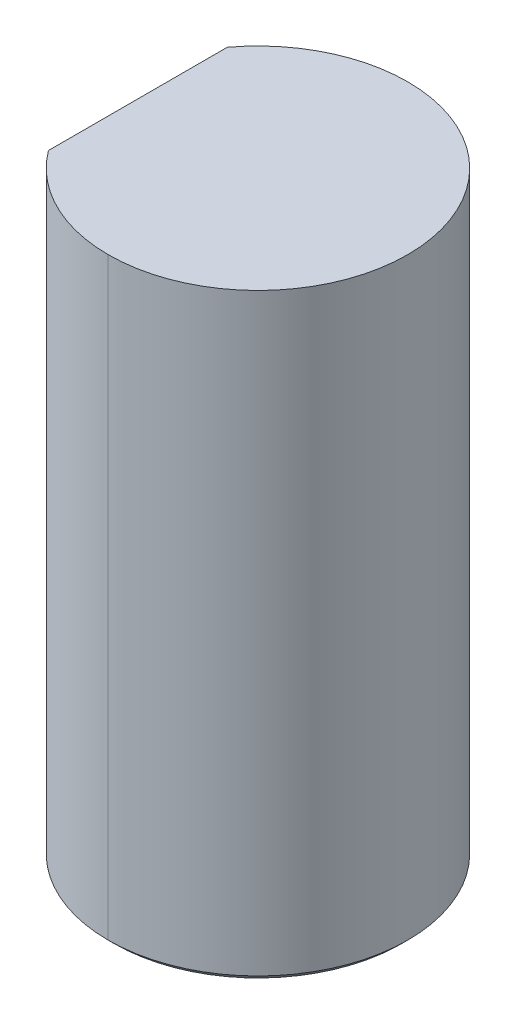
ISO-10303-21;
HEADER;
FILE_DESCRIPTION(('STEP AP214'),'2;1');
FILE_NAME('part.step','',(''),(''),'','','');
FILE_SCHEMA(('AUTOMOTIVE_DESIGN { 1 0 10303 214 1 1 1 1 }'));
ENDSEC;
DATA;
#1=APPLICATION_CONTEXT('core data for automotive mechanical design processes');
#2=APPLICATION_PROTOCOL_DEFINITION('international standard','automotive_design',2000,#1);
#3=PRODUCT_CONTEXT('',#1,'mechanical');
#4=PRODUCT('Part','Part','',(#3));
#5=PRODUCT_RELATED_PRODUCT_CATEGORY('part','',(#4));
#6=PRODUCT_DEFINITION_FORMATION('','',#4);
#7=PRODUCT_DEFINITION_CONTEXT('part definition',#1,'design');
#8=PRODUCT_DEFINITION('design','',#6,#7);
#9=PRODUCT_DEFINITION_SHAPE('','',#8);
#10=(LENGTH_UNIT() NAMED_UNIT(*) SI_UNIT(.MILLI.,.METRE.));
#11=(NAMED_UNIT(*) PLANE_ANGLE_UNIT() SI_UNIT($,.RADIAN.));
#12=(NAMED_UNIT(*) SI_UNIT($,.STERADIAN.) SOLID_ANGLE_UNIT());
#13=UNCERTAINTY_MEASURE_WITH_UNIT(LENGTH_MEASURE(1.E-05),#10,'distance_accuracy_value','');
#14=(GEOMETRIC_REPRESENTATION_CONTEXT(3) GLOBAL_UNCERTAINTY_ASSIGNED_CONTEXT((#13)) GLOBAL_UNIT_ASSIGNED_CONTEXT((#10,
#11,#12)) REPRESENTATION_CONTEXT('',''));
#15=CARTESIAN_POINT('',(0.,0.,0.));
#16=DIRECTION('',(0.,0.,1.));
#17=DIRECTION('',(1.,0.,0.));
#18=AXIS2_PLACEMENT_3D('',#15,#16,#17);
#19=CARTESIAN_POINT('',(0.,0.127000000000002,0.));
#20=DIRECTION('',(0.,1.,0.));
#21=DIRECTION('',(0.,0.,1.));
#22=AXIS2_PLACEMENT_3D('',#19,#20,#21);
#23=CONICAL_SURFACE('',#22,3.17119,0.785398163397457);
#24=DIRECTION('',(0.,0.707106781186542,-0.707106781186554));
#25=VECTOR('',#24,1.);
#26=CARTESIAN_POINT('',(0.,0.127000000000002,-3.17119));
#27=LINE('',#26,#25);
#28=CARTESIAN_POINT('',(0.,0.,-3.04419));
#29=VERTEX_POINT('',#28);
#30=CARTESIAN_POINT('',(0.,0.127000000000002,-3.17119));
#31=VERTEX_POINT('',#30);
#32=EDGE_CURVE('E120',#29,#31,#27,.T.);
#33=ORIENTED_EDGE('',*,*,#32,.F.);
#34=CARTESIAN_POINT('',(0.,0.,0.));
#35=DIRECTION('',(0.,-1.,0.));
#36=DIRECTION('',(0.,0.,1.));
#37=AXIS2_PLACEMENT_3D('',#34,#35,#36);
#38=CIRCLE('',#37,3.04419);
#39=CARTESIAN_POINT('',(-2.54381,0.,-1.67216130800829));
#40=VERTEX_POINT('',#39);
#41=EDGE_CURVE('E44',#40,#29,#38,.T.);
#42=ORIENTED_EDGE('',*,*,#41,.F.);
#43=CARTESIAN_POINT('',(-2.54381,0.127000000000002,-1.89353550270387));
#44=CARTESIAN_POINT('',(-2.54381,0.08338625355595,-1.8204935785422));
#45=CARTESIAN_POINT('',(-2.54381,0.0409575857320566,-1.74672509100731));
#46=CARTESIAN_POINT('',(-2.54381,0.,-1.67216130800829));
#47=(BOUNDED_CURVE() B_SPLINE_CURVE(3,(#43,#44,#45,#46),.UNSPECIFIED.,.F.,
.F.) B_SPLINE_CURVE_WITH_KNOTS((4,4),(0.,0.000255216641458037),
.UNSPECIFIED.) CURVE() GEOMETRIC_REPRESENTATION_ITEM() RATIONAL_B_SPLINE_CURVE((1.,1.,1.,1.)) REPRESENTATION_ITEM(''));
#48=CARTESIAN_POINT('',(-2.54381,0.127000000000002,-1.89353550270387));
#49=VERTEX_POINT('',#48);
#50=EDGE_CURVE('E131',#49,#40,#47,.T.);
#51=ORIENTED_EDGE('',*,*,#50,.F.);
#52=CARTESIAN_POINT('',(0.,0.127000000000002,0.));
#53=DIRECTION('',(0.,1.,0.));
#54=DIRECTION('',(0.,0.,1.));
#55=AXIS2_PLACEMENT_3D('',#52,#53,#54);
#56=CIRCLE('',#55,3.17119);
#57=EDGE_CURVE('E145',#31,#49,#56,.T.);
#58=ORIENTED_EDGE('',*,*,#57,.F.);
#59=EDGE_LOOP('',(#33,#42,#51,#58));
#60=FACE_BOUND('',#59,.T.);
#61=ADVANCED_FACE('F36',(#60),#23,.T.);
#62=CARTESIAN_POINT('',(0.,0.,0.));
#63=DIRECTION('',(0.,1.,0.));
#64=DIRECTION('',(1.,0.,0.));
#65=AXIS2_PLACEMENT_3D('',#62,#63,#64);
#66=PLANE('',#65);
#67=DIRECTION('',(0.,0.,1.));
#68=VECTOR('',#67,1.);
#69=CARTESIAN_POINT('',(-2.54381,0.,-1.89353550270387));
#70=LINE('',#69,#68);
#71=CARTESIAN_POINT('',(-2.54381,0.,1.67216130800829));
#72=VERTEX_POINT('',#71);
#73=EDGE_CURVE('E76',#40,#72,#70,.T.);
#74=ORIENTED_EDGE('',*,*,#73,.F.);
#75=ORIENTED_EDGE('',*,*,#41,.T.);
#76=CARTESIAN_POINT('',(0.,0.,0.));
#77=DIRECTION('',(0.,-1.,0.));
#78=DIRECTION('',(0.,0.,1.));
#79=AXIS2_PLACEMENT_3D('',#76,#77,#78);
#80=CIRCLE('',#79,3.04419);
#81=CARTESIAN_POINT('',(0.,0.,3.04419));
#82=VERTEX_POINT('',#81);
#83=EDGE_CURVE('E126',#29,#82,#80,.T.);
#84=ORIENTED_EDGE('',*,*,#83,.T.);
#85=CARTESIAN_POINT('',(0.,0.,0.));
#86=DIRECTION('',(0.,-1.,0.));
#87=DIRECTION('',(0.,0.,1.));
#88=AXIS2_PLACEMENT_3D('',#85,#86,#87);
#89=CIRCLE('',#88,3.04419);
#90=EDGE_CURVE('E107',#82,#72,#89,.T.);
#91=ORIENTED_EDGE('',*,*,#90,.T.);
#92=EDGE_LOOP('',(#74,#75,#84,#91));
#93=FACE_BOUND('',#92,.T.);
#94=ADVANCED_FACE('F156',(#93),#66,.F.);
#95=CARTESIAN_POINT('',(-2.54381,50.8,-1.89353550270387));
#96=DIRECTION('',(1.,0.,0.));
#97=DIRECTION('',(0.,1.,0.));
#98=AXIS2_PLACEMENT_3D('',#95,#96,#97);
#99=PLANE('',#98);
#100=DIRECTION('',(0.,-1.,0.));
#101=VECTOR('',#100,1.);
#102=CARTESIAN_POINT('',(-2.54381,50.8,1.89353550270387));
#103=LINE('',#102,#101);
#104=CARTESIAN_POINT('',(-2.54381,12.7,1.89353550270387));
#105=VERTEX_POINT('',#104);
#106=CARTESIAN_POINT('',(-2.54381,0.127000000000002,1.89353550270387));
#107=VERTEX_POINT('',#106);
#108=EDGE_CURVE('E104',#105,#107,#103,.T.);
#109=ORIENTED_EDGE('',*,*,#108,.F.);
#110=DIRECTION('',(0.,0.,-1.));
#111=VECTOR('',#110,1.);
#112=CARTESIAN_POINT('',(-2.54381,12.7,-1.89353550270387));
#113=LINE('',#112,#111);
#114=CARTESIAN_POINT('',(-2.54381,12.7,-1.89353550270387));
#115=VERTEX_POINT('',#114);
#116=EDGE_CURVE('E134',#105,#115,#113,.T.);
#117=ORIENTED_EDGE('',*,*,#116,.T.);
#118=DIRECTION('',(0.,-1.,0.));
#119=VECTOR('',#118,1.);
#120=CARTESIAN_POINT('',(-2.54381,50.8,-1.89353550270387));
#121=LINE('',#120,#119);
#122=EDGE_CURVE('E132',#115,#49,#121,.T.);
#123=ORIENTED_EDGE('',*,*,#122,.T.);
#124=ORIENTED_EDGE('',*,*,#50,.T.);
#125=ORIENTED_EDGE('',*,*,#73,.T.);
#126=CARTESIAN_POINT('',(-2.54381,0.,1.67216130800829));
#127=CARTESIAN_POINT('',(-2.54381,0.0409575857320628,1.7467250910073));
#128=CARTESIAN_POINT('',(-2.54381,0.0833862535559464,1.82049357854221));
#129=CARTESIAN_POINT('',(-2.54381,0.127000000000002,1.89353550270387));
#130=(BOUNDED_CURVE() B_SPLINE_CURVE(3,(#126,#127,#128,#129),.UNSPECIFIED.,.F.,
.F.) B_SPLINE_CURVE_WITH_KNOTS((4,4),(0.,0.000255216641458037),
.UNSPECIFIED.) CURVE() GEOMETRIC_REPRESENTATION_ITEM() RATIONAL_B_SPLINE_CURVE((1.,1.,1.,1.)) REPRESENTATION_ITEM(''));
#131=EDGE_CURVE('E97',#72,#107,#130,.T.);
#132=ORIENTED_EDGE('',*,*,#131,.T.);
#133=EDGE_LOOP('',(#109,#117,#123,#124,#125,#132));
#134=FACE_BOUND('',#133,.T.);
#135=ADVANCED_FACE('F151',(#134),#99,.F.);
#136=CARTESIAN_POINT('',(0.,50.8,0.));
#137=DIRECTION('',(0.,-1.,0.));
#138=DIRECTION('',(0.,0.,-1.));
#139=AXIS2_PLACEMENT_3D('',#136,#137,#138);
#140=CYLINDRICAL_SURFACE('',#139,3.17119);
#141=CARTESIAN_POINT('',(0.,12.7,0.));
#142=DIRECTION('',(0.,-1.,0.));
#143=DIRECTION('',(0.,0.,-1.));
#144=AXIS2_PLACEMENT_3D('',#141,#142,#143);
#145=CIRCLE('',#144,3.17119);
#146=CARTESIAN_POINT('',(0.,12.7,3.17119));
#147=VERTEX_POINT('',#146);
#148=EDGE_CURVE('E233',#105,#147,#145,.F.);
#149=ORIENTED_EDGE('',*,*,#148,.F.);
#150=ORIENTED_EDGE('',*,*,#108,.T.);
#151=CARTESIAN_POINT('',(0.,0.127000000000002,0.));
#152=DIRECTION('',(0.,1.,0.));
#153=DIRECTION('',(0.,0.,1.));
#154=AXIS2_PLACEMENT_3D('',#151,#152,#153);
#155=CIRCLE('',#154,3.17119);
#156=CARTESIAN_POINT('',(0.,0.127000000000002,3.17119));
#157=VERTEX_POINT('',#156);
#158=EDGE_CURVE('E100',#107,#157,#155,.T.);
#159=ORIENTED_EDGE('',*,*,#158,.T.);
#160=DIRECTION('',(0.,-1.,0.));
#161=VECTOR('',#160,1.);
#162=CARTESIAN_POINT('',(0.,50.8,3.17119));
#163=LINE('',#162,#161);
#164=EDGE_CURVE('E85',#147,#157,#163,.T.);
#165=ORIENTED_EDGE('',*,*,#164,.F.);
#166=EDGE_LOOP('',(#149,#150,#159,#165));
#167=FACE_BOUND('',#166,.T.);
#168=ADVANCED_FACE('F102',(#167),#140,.T.);
#169=CARTESIAN_POINT('',(0.,50.8,0.));
#170=DIRECTION('',(0.,-1.,0.));
#171=DIRECTION('',(0.,0.,-1.));
#172=AXIS2_PLACEMENT_3D('',#169,#170,#171);
#173=CYLINDRICAL_SURFACE('',#172,3.17119);
#174=CARTESIAN_POINT('',(0.,12.7,0.));
#175=DIRECTION('',(0.,-1.,0.));
#176=DIRECTION('',(0.,0.,-1.));
#177=AXIS2_PLACEMENT_3D('',#174,#175,#176);
#178=CIRCLE('',#177,3.17119);
#179=CARTESIAN_POINT('',(0.,12.7,-3.17119));
#180=VERTEX_POINT('',#179);
#181=EDGE_CURVE('E231',#180,#115,#178,.F.);
#182=ORIENTED_EDGE('',*,*,#181,.F.);
#183=DIRECTION('',(0.,-1.,0.));
#184=VECTOR('',#183,1.);
#185=CARTESIAN_POINT('',(0.,50.8,-3.17119));
#186=LINE('',#185,#184);
#187=EDGE_CURVE('E96',#180,#31,#186,.T.);
#188=ORIENTED_EDGE('',*,*,#187,.T.);
#189=ORIENTED_EDGE('',*,*,#57,.T.);
#190=ORIENTED_EDGE('',*,*,#122,.F.);
#191=EDGE_LOOP('',(#182,#188,#189,#190));
#192=FACE_BOUND('',#191,.T.);
#193=ADVANCED_FACE('F162',(#192),#173,.T.);
#194=CARTESIAN_POINT('',(0.,50.8,0.));
#195=DIRECTION('',(0.,-1.,0.));
#196=DIRECTION('',(0.,0.,-1.));
#197=AXIS2_PLACEMENT_3D('',#194,#195,#196);
#198=CYLINDRICAL_SURFACE('',#197,3.17119);
#199=CARTESIAN_POINT('',(0.,12.7,0.));
#200=DIRECTION('',(0.,-1.,0.));
#201=DIRECTION('',(0.,0.,-1.));
#202=AXIS2_PLACEMENT_3D('',#199,#200,#201);
#203=CIRCLE('',#202,3.17119);
#204=EDGE_CURVE('E11',#147,#180,#203,.F.);
#205=ORIENTED_EDGE('',*,*,#204,.F.);
#206=ORIENTED_EDGE('',*,*,#164,.T.);
#207=CARTESIAN_POINT('',(0.,0.127000000000002,0.));
#208=DIRECTION('',(0.,1.,0.));
#209=DIRECTION('',(0.,0.,1.));
#210=AXIS2_PLACEMENT_3D('',#207,#208,#209);
#211=CIRCLE('',#210,3.17119);
#212=EDGE_CURVE('E90',#157,#31,#211,.T.);
#213=ORIENTED_EDGE('',*,*,#212,.T.);
#214=ORIENTED_EDGE('',*,*,#187,.F.);
#215=EDGE_LOOP('',(#205,#206,#213,#214));
#216=FACE_BOUND('',#215,.T.);
#217=ADVANCED_FACE('F87',(#216),#198,.T.);
#218=CARTESIAN_POINT('',(0.,0.127000000000002,0.));
#219=DIRECTION('',(0.,1.,0.));
#220=DIRECTION('',(0.,0.,1.));
#221=AXIS2_PLACEMENT_3D('',#218,#219,#220);
#222=CONICAL_SURFACE('',#221,3.17119,0.785398163397457);
#223=ORIENTED_EDGE('',*,*,#90,.F.);
#224=DIRECTION('',(0.,0.707106781186542,0.707106781186554));
#225=VECTOR('',#224,1.);
#226=CARTESIAN_POINT('',(0.,0.127000000000002,3.17119));
#227=LINE('',#226,#225);
#228=EDGE_CURVE('E111',#82,#157,#227,.T.);
#229=ORIENTED_EDGE('',*,*,#228,.T.);
#230=ORIENTED_EDGE('',*,*,#158,.F.);
#231=ORIENTED_EDGE('',*,*,#131,.F.);
#232=EDGE_LOOP('',(#223,#229,#230,#231));
#233=FACE_BOUND('',#232,.T.);
#234=ADVANCED_FACE('F112',(#233),#222,.T.);
#235=CARTESIAN_POINT('',(0.,0.127000000000002,0.));
#236=DIRECTION('',(0.,1.,0.));
#237=DIRECTION('',(0.,0.,1.));
#238=AXIS2_PLACEMENT_3D('',#235,#236,#237);
#239=CONICAL_SURFACE('',#238,3.17119,0.785398163397457);
#240=ORIENTED_EDGE('',*,*,#83,.F.);
#241=ORIENTED_EDGE('',*,*,#32,.T.);
#242=ORIENTED_EDGE('',*,*,#212,.F.);
#243=ORIENTED_EDGE('',*,*,#228,.F.);
#244=EDGE_LOOP('',(#240,#241,#242,#243));
#245=FACE_BOUND('',#244,.T.);
#246=ADVANCED_FACE('F119',(#245),#239,.T.);
#247=CARTESIAN_POINT('',(3.17119,12.7,-3.17119));
#248=DIRECTION('',(0.,-1.,0.));
#249=DIRECTION('',(0.,0.,-1.));
#250=AXIS2_PLACEMENT_3D('',#247,#248,#249);
#251=PLANE('',#250);
#252=ORIENTED_EDGE('',*,*,#148,.T.);
#253=ORIENTED_EDGE('',*,*,#204,.T.);
#254=ORIENTED_EDGE('',*,*,#181,.T.);
#255=ORIENTED_EDGE('',*,*,#116,.F.);
#256=EDGE_LOOP('',(#252,#253,#254,#255));
#257=FACE_BOUND('',#256,.T.);
#258=ADVANCED_FACE('F193',(#257),#251,.F.);
#259=CLOSED_SHELL('',(#61,#94,#135,#168,#193,#217,#234,#246,#258));
#260=MANIFOLD_SOLID_BREP('B2',#259);
#261=ADVANCED_BREP_SHAPE_REPRESENTATION('',(#18,#260),#14);
#262=SHAPE_DEFINITION_REPRESENTATION(#9,#261);
ENDSEC;
END-ISO-10303-21;
